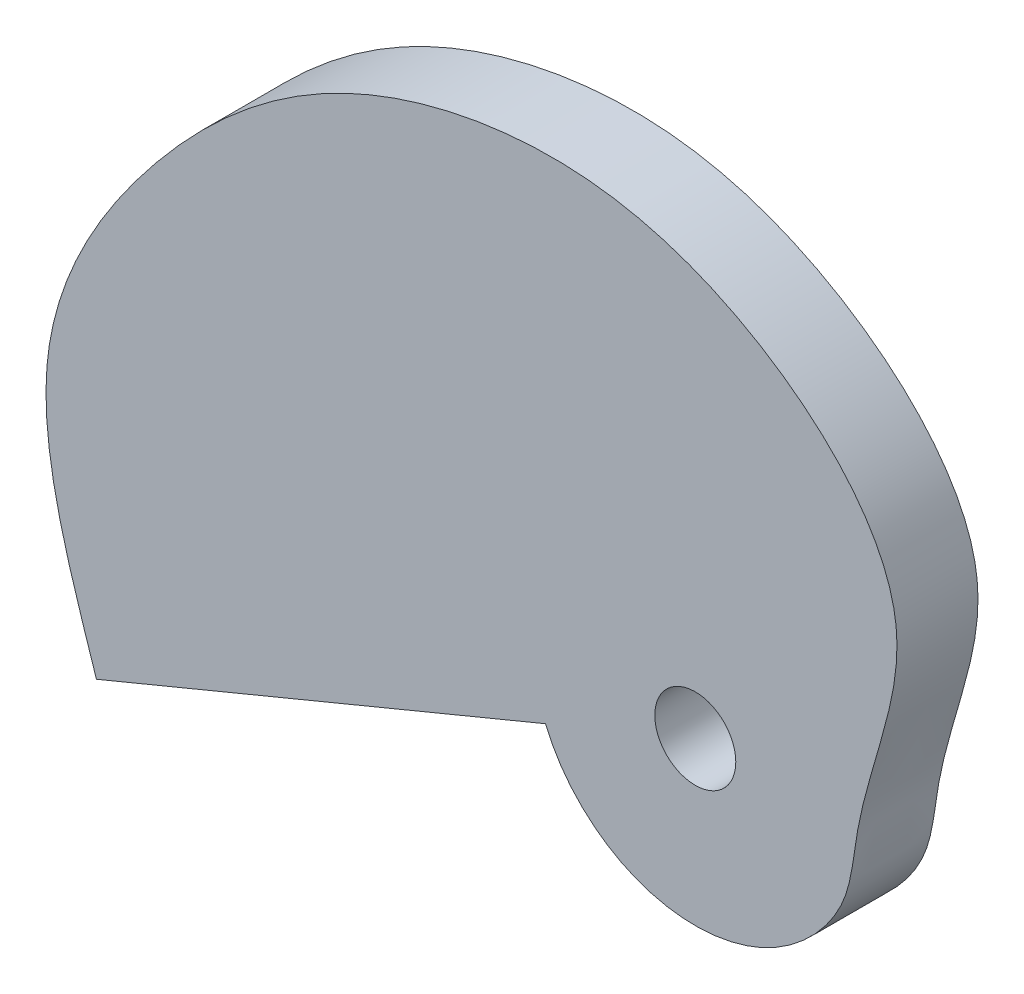
ISO-10303-21;
HEADER;
FILE_DESCRIPTION(('STEP AP214'),'2;1');
FILE_NAME('part.step','',(''),(''),'','','');
FILE_SCHEMA(('AUTOMOTIVE_DESIGN { 1 0 10303 214 1 1 1 1 }'));
ENDSEC;
DATA;
#1=APPLICATION_CONTEXT('core data for automotive mechanical design processes');
#2=APPLICATION_PROTOCOL_DEFINITION('international standard','automotive_design',2000,#1);
#3=PRODUCT_CONTEXT('',#1,'mechanical');
#4=PRODUCT('Part','Part','',(#3));
#5=PRODUCT_RELATED_PRODUCT_CATEGORY('part','',(#4));
#6=PRODUCT_DEFINITION_FORMATION('','',#4);
#7=PRODUCT_DEFINITION_CONTEXT('part definition',#1,'design');
#8=PRODUCT_DEFINITION('design','',#6,#7);
#9=PRODUCT_DEFINITION_SHAPE('','',#8);
#10=(LENGTH_UNIT() NAMED_UNIT(*) SI_UNIT(.MILLI.,.METRE.));
#11=(NAMED_UNIT(*) PLANE_ANGLE_UNIT() SI_UNIT($,.RADIAN.));
#12=(NAMED_UNIT(*) SI_UNIT($,.STERADIAN.) SOLID_ANGLE_UNIT());
#13=UNCERTAINTY_MEASURE_WITH_UNIT(LENGTH_MEASURE(1.E-05),#10,'distance_accuracy_value','');
#14=(GEOMETRIC_REPRESENTATION_CONTEXT(3) GLOBAL_UNCERTAINTY_ASSIGNED_CONTEXT((#13)) GLOBAL_UNIT_ASSIGNED_CONTEXT((#10,
#11,#12)) REPRESENTATION_CONTEXT('',''));
#15=CARTESIAN_POINT('',(0.,0.,0.));
#16=DIRECTION('',(0.,0.,1.));
#17=DIRECTION('',(1.,0.,0.));
#18=AXIS2_PLACEMENT_3D('',#15,#16,#17);
#19=CARTESIAN_POINT('',(-6.86865597261312,33.5519189120389,6.35));
#20=DIRECTION('',(0.,0.,-1.));
#21=DIRECTION('',(-1.,0.,0.));
#22=AXIS2_PLACEMENT_3D('',#19,#20,#21);
#23=PLANE('',#22);
#24=CARTESIAN_POINT('',(-11.7332700628933,-4.86007959103665,6.35));
#25=CARTESIAN_POINT('',(-10.4874952034902,-7.95699455336196,6.35));
#26=CARTESIAN_POINT('',(-6.64935925033134,-11.7103605505876,6.35));
#27=CARTESIAN_POINT('',(-0.00214162139438828,-13.0302110865799,6.35));
#28=CARTESIAN_POINT('',(4.99612132867442,-12.0388324690946,6.35));
#29=CARTESIAN_POINT('',(9.17813385291638,-9.21407941440184,6.35));
#30=CARTESIAN_POINT('',(12.1728799860749,-4.98638659971306,6.35));
#31=CARTESIAN_POINT('',(12.7953176492885,3.70389952098746,6.35));
#32=CARTESIAN_POINT('',(20.1376618141591,18.2934937508443,6.35));
#33=CARTESIAN_POINT('',(2.73172186133779,32.7215241702152,6.35));
#34=CARTESIAN_POINT('',(-14.5209476872235,34.7130952792649,6.35));
#35=CARTESIAN_POINT('',(-30.4318042819728,29.9721348051724,6.35));
#36=CARTESIAN_POINT('',(-43.5439195821416,17.9029001248593,6.35));
#37=CARTESIAN_POINT('',(-53.813801552127,0.199176096637106,6.35));
#38=CARTESIAN_POINT('',(-48.9004405292411,-13.417723456242,6.35));
#39=CARTESIAN_POINT('',(-46.9330802515733,-19.4403183641466,6.35));
#40=B_SPLINE_CURVE_WITH_KNOTS('',3,(#24,#25,#26,#27,#28,#29,#30,#31,#32,#33,#34,#35,#36,#37,#38,
#39),.UNSPECIFIED.,.F.,.F.,(4,1,1,1,1,1,1,1,1,1,1,1,1,4),(0.,0.0618744378361,0.0928116567541503,
0.123748875672201,0.154686094590251,0.185623313508301,0.216560532426351,0.316466098960384,
0.456638493895921,0.544748216512132,0.643879921442465,0.754152557389486,0.875652356436372,1.),.UNSPECIFIED.);
#41=CARTESIAN_POINT('',(-11.7332700628933,-4.86007959103665,6.35));
#42=VERTEX_POINT('',#41);
#43=CARTESIAN_POINT('',(-46.9330802515733,-19.4403183641466,6.35));
#44=VERTEX_POINT('',#43);
#45=EDGE_CURVE('E73',#42,#44,#40,.T.);
#46=ORIENTED_EDGE('',*,*,#45,.T.);
#47=DIRECTION('',(0.923879532511286,0.382683432365091,0.));
#48=VECTOR('',#47,1.);
#49=CARTESIAN_POINT('',(-11.7332700628933,-4.86007959103665,6.35));
#50=LINE('',#49,#48);
#51=EDGE_CURVE('E57',#44,#42,#50,.T.);
#52=ORIENTED_EDGE('',*,*,#51,.T.);
#53=EDGE_LOOP('',(#46,#52));
#54=FACE_BOUND('',#53,.T.);
#55=CARTESIAN_POINT('',(0.,0.,6.35));
#56=DIRECTION('',(0.,0.,1.));
#57=DIRECTION('',(1.,0.,0.));
#58=AXIS2_PLACEMENT_3D('',#55,#56,#57);
#59=CIRCLE('',#58,3.175);
#60=CARTESIAN_POINT('',(3.175,0.,6.35));
#61=VERTEX_POINT('',#60);
#62=EDGE_CURVE('E81',#61,#61,#59,.T.);
#63=ORIENTED_EDGE('',*,*,#62,.F.);
#64=EDGE_LOOP('',(#63));
#65=FACE_BOUND('',#64,.T.);
#66=ADVANCED_FACE('F39',(#54,#65),#23,.F.);
#67=CARTESIAN_POINT('',(-6.86865597261312,33.5519189120389,0.));
#68=DIRECTION('',(0.,0.,-1.));
#69=DIRECTION('',(-1.,0.,0.));
#70=AXIS2_PLACEMENT_3D('',#67,#68,#69);
#71=PLANE('',#70);
#72=CARTESIAN_POINT('',(-11.7332700628933,-4.86007959103665,0.));
#73=CARTESIAN_POINT('',(-10.4874952034902,-7.95699455336196,0.));
#74=CARTESIAN_POINT('',(-6.64935925033134,-11.7103605505876,0.));
#75=CARTESIAN_POINT('',(-0.00214162139438828,-13.0302110865799,0.));
#76=CARTESIAN_POINT('',(4.99612132867442,-12.0388324690946,0.));
#77=CARTESIAN_POINT('',(9.17813385291638,-9.21407941440184,0.));
#78=CARTESIAN_POINT('',(12.1728799860749,-4.98638659971306,0.));
#79=CARTESIAN_POINT('',(12.7953176492885,3.70389952098746,0.));
#80=CARTESIAN_POINT('',(20.1376618141591,18.2934937508443,0.));
#81=CARTESIAN_POINT('',(2.73172186133779,32.7215241702152,0.));
#82=CARTESIAN_POINT('',(-14.5209476872235,34.7130952792649,0.));
#83=CARTESIAN_POINT('',(-30.4318042819728,29.9721348051724,0.));
#84=CARTESIAN_POINT('',(-43.5439195821416,17.9029001248593,0.));
#85=CARTESIAN_POINT('',(-53.813801552127,0.199176096637106,0.));
#86=CARTESIAN_POINT('',(-48.9004405292411,-13.417723456242,0.));
#87=CARTESIAN_POINT('',(-46.9330802515733,-19.4403183641466,0.));
#88=B_SPLINE_CURVE_WITH_KNOTS('',3,(#72,#73,#74,#75,#76,#77,#78,#79,#80,#81,#82,#83,#84,#85,#86,
#87),.UNSPECIFIED.,.F.,.F.,(4,1,1,1,1,1,1,1,1,1,1,1,1,4),(0.,0.0618744378361,0.0928116567541503,
0.123748875672201,0.154686094590251,0.185623313508301,0.216560532426351,0.316466098960384,
0.456638493895921,0.544748216512132,0.643879921442465,0.754152557389486,0.875652356436372,1.),.UNSPECIFIED.);
#89=CARTESIAN_POINT('',(-11.7332700628933,-4.86007959103665,0.));
#90=VERTEX_POINT('',#89);
#91=CARTESIAN_POINT('',(-46.9330802515733,-19.4403183641466,0.));
#92=VERTEX_POINT('',#91);
#93=EDGE_CURVE('E74',#90,#92,#88,.T.);
#94=ORIENTED_EDGE('',*,*,#93,.F.);
#95=DIRECTION('',(0.923879532511286,0.382683432365091,0.));
#96=VECTOR('',#95,1.);
#97=CARTESIAN_POINT('',(-11.7332700628933,-4.86007959103665,0.));
#98=LINE('',#97,#96);
#99=EDGE_CURVE('E65',#92,#90,#98,.T.);
#100=ORIENTED_EDGE('',*,*,#99,.F.);
#101=EDGE_LOOP('',(#94,#100));
#102=FACE_BOUND('',#101,.T.);
#103=CARTESIAN_POINT('',(0.,0.,0.));
#104=DIRECTION('',(0.,0.,1.));
#105=DIRECTION('',(1.,0.,0.));
#106=AXIS2_PLACEMENT_3D('',#103,#104,#105);
#107=CIRCLE('',#106,3.175);
#108=CARTESIAN_POINT('',(3.175,0.,0.));
#109=VERTEX_POINT('',#108);
#110=EDGE_CURVE('E85',#109,#109,#107,.T.);
#111=ORIENTED_EDGE('',*,*,#110,.T.);
#112=EDGE_LOOP('',(#111));
#113=FACE_BOUND('',#112,.T.);
#114=ADVANCED_FACE('F78',(#102,#113),#71,.T.);
#115=DIRECTION('',(0.,0.,-1.));
#116=VECTOR('',#115,1.);
#117=SURFACE_OF_LINEAR_EXTRUSION('',#40,#116);
#118=ORIENTED_EDGE('',*,*,#93,.T.);
#119=DIRECTION('',(0.,0.,-1.));
#120=VECTOR('',#119,1.);
#121=CARTESIAN_POINT('',(-46.9330802515733,-19.4403183641466,6.35));
#122=LINE('',#121,#120);
#123=EDGE_CURVE('E11',#44,#92,#122,.T.);
#124=ORIENTED_EDGE('',*,*,#123,.F.);
#125=ORIENTED_EDGE('',*,*,#45,.F.);
#126=DIRECTION('',(0.,0.,-1.));
#127=VECTOR('',#126,1.);
#128=CARTESIAN_POINT('',(-11.7332700628933,-4.86007959103665,6.35));
#129=LINE('',#128,#127);
#130=EDGE_CURVE('E50',#42,#90,#129,.T.);
#131=ORIENTED_EDGE('',*,*,#130,.T.);
#132=EDGE_LOOP('',(#118,#124,#125,#131));
#133=FACE_BOUND('',#132,.T.);
#134=ADVANCED_FACE('F41',(#133),#117,.F.);
#135=CARTESIAN_POINT('',(-11.7332700628933,-4.86007959103665,6.35));
#136=DIRECTION('',(-0.382683432365091,0.923879532511286,0.));
#137=DIRECTION('',(-0.923879532511286,-0.382683432365091,0.));
#138=AXIS2_PLACEMENT_3D('',#135,#136,#137);
#139=PLANE('',#138);
#140=ORIENTED_EDGE('',*,*,#99,.T.);
#141=ORIENTED_EDGE('',*,*,#130,.F.);
#142=ORIENTED_EDGE('',*,*,#51,.F.);
#143=ORIENTED_EDGE('',*,*,#123,.T.);
#144=EDGE_LOOP('',(#140,#141,#142,#143));
#145=FACE_BOUND('',#144,.T.);
#146=ADVANCED_FACE('F68',(#145),#139,.F.);
#147=CARTESIAN_POINT('',(0.,0.,6.35));
#148=DIRECTION('',(0.,0.,-1.));
#149=DIRECTION('',(-1.,0.,0.));
#150=AXIS2_PLACEMENT_3D('',#147,#148,#149);
#151=CYLINDRICAL_SURFACE('',#150,3.175);
#152=ORIENTED_EDGE('',*,*,#62,.T.);
#153=EDGE_LOOP('',(#152));
#154=FACE_BOUND('',#153,.T.);
#155=ORIENTED_EDGE('',*,*,#110,.F.);
#156=EDGE_LOOP('',(#155));
#157=FACE_BOUND('',#156,.T.);
#158=ADVANCED_FACE('F106',(#154,#157),#151,.F.);
#159=CLOSED_SHELL('',(#66,#114,#134,#146,#158));
#160=MANIFOLD_SOLID_BREP('B2',#159);
#161=ADVANCED_BREP_SHAPE_REPRESENTATION('',(#18,#160),#14);
#162=SHAPE_DEFINITION_REPRESENTATION(#9,#161);
ENDSEC;
END-ISO-10303-21;
